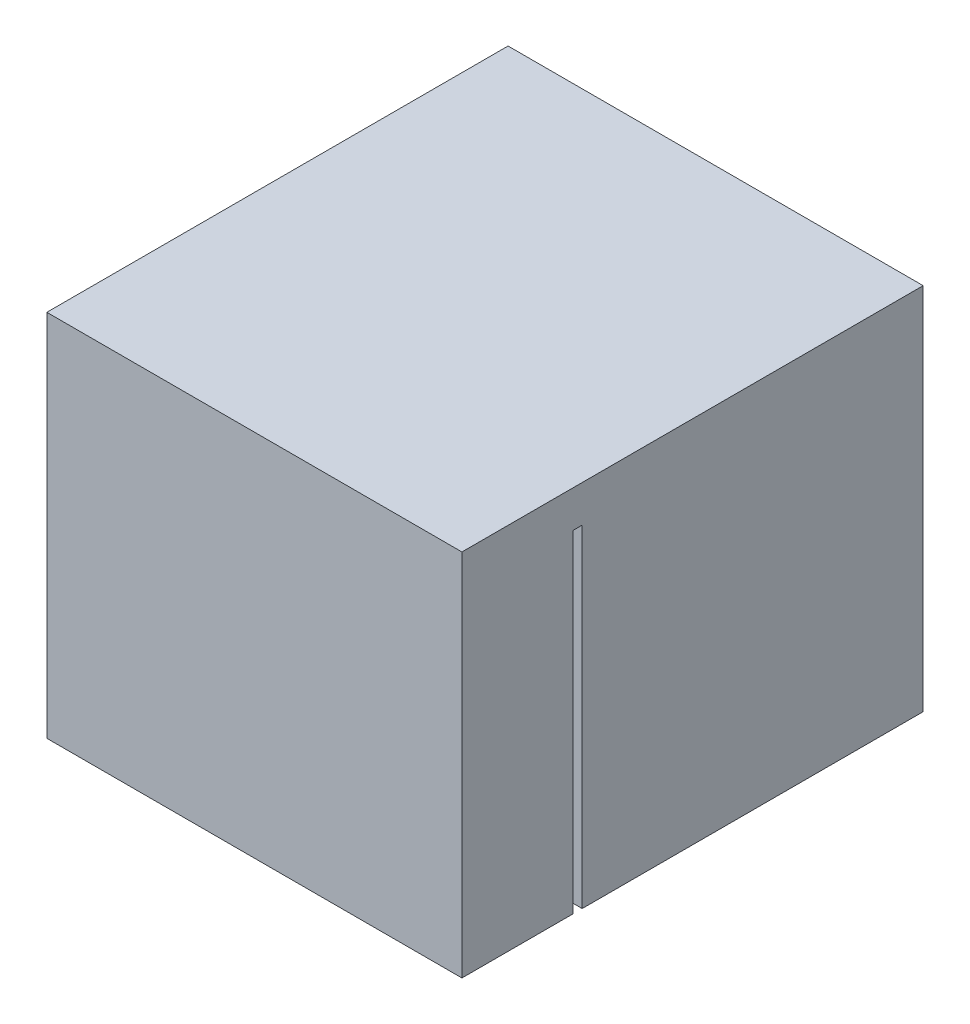
ISO-10303-21;
HEADER;
FILE_DESCRIPTION(('STEP AP214'),'2;1');
FILE_NAME('part.step','',(''),(''),'','','');
FILE_SCHEMA(('AUTOMOTIVE_DESIGN { 1 0 10303 214 1 1 1 1 }'));
ENDSEC;
DATA;
#1=APPLICATION_CONTEXT('core data for automotive mechanical design processes');
#2=APPLICATION_PROTOCOL_DEFINITION('international standard','automotive_design',2000,#1);
#3=PRODUCT_CONTEXT('',#1,'mechanical');
#4=PRODUCT('Part','Part','',(#3));
#5=PRODUCT_RELATED_PRODUCT_CATEGORY('part','',(#4));
#6=PRODUCT_DEFINITION_FORMATION('','',#4);
#7=PRODUCT_DEFINITION_CONTEXT('part definition',#1,'design');
#8=PRODUCT_DEFINITION('design','',#6,#7);
#9=PRODUCT_DEFINITION_SHAPE('','',#8);
#10=(LENGTH_UNIT() NAMED_UNIT(*) SI_UNIT(.MILLI.,.METRE.));
#11=(NAMED_UNIT(*) PLANE_ANGLE_UNIT() SI_UNIT($,.RADIAN.));
#12=(NAMED_UNIT(*) SI_UNIT($,.STERADIAN.) SOLID_ANGLE_UNIT());
#13=UNCERTAINTY_MEASURE_WITH_UNIT(LENGTH_MEASURE(1.E-05),#10,'distance_accuracy_value','');
#14=(GEOMETRIC_REPRESENTATION_CONTEXT(3) GLOBAL_UNCERTAINTY_ASSIGNED_CONTEXT((#13)) GLOBAL_UNIT_ASSIGNED_CONTEXT((#10,
#11,#12)) REPRESENTATION_CONTEXT('',''));
#15=CARTESIAN_POINT('',(0.,0.,0.));
#16=DIRECTION('',(0.,0.,1.));
#17=DIRECTION('',(1.,0.,0.));
#18=AXIS2_PLACEMENT_3D('',#15,#16,#17);
#19=CARTESIAN_POINT('',(275.,29.8959813156576,57.8606367334853));
#20=DIRECTION('',(0.,1.,0.));
#21=DIRECTION('',(-1.,0.,0.));
#22=AXIS2_PLACEMENT_3D('',#19,#20,#21);
#23=PLANE('',#22);
#24=CARTESIAN_POINT('',(236.1003731068,29.8959813156576,50.8138150272263));
#25=DIRECTION('',(0.,-1.,0.));
#26=DIRECTION('',(-1.,0.,0.));
#27=AXIS2_PLACEMENT_3D('',#24,#25,#26);
#28=CIRCLE('',#27,4.);
#29=CARTESIAN_POINT('',(232.1003731068,29.8959813156576,50.8138150272263));
#30=VERTEX_POINT('',#29);
#31=CARTESIAN_POINT('',(236.1003731068,29.8959813156576,46.8138150272262));
#32=VERTEX_POINT('',#31);
#33=EDGE_CURVE('E392',#30,#32,#28,.T.);
#34=ORIENTED_EDGE('',*,*,#33,.F.);
#35=DIRECTION('',(0.,0.,-1.));
#36=VECTOR('',#35,1.);
#37=CARTESIAN_POINT('',(232.1003731068,29.8959813156576,56.186716494128));
#38=LINE('',#37,#36);
#39=CARTESIAN_POINT('',(232.1003731068,29.8959813156576,56.186716494128));
#40=VERTEX_POINT('',#39);
#41=EDGE_CURVE('E360',#40,#30,#38,.T.);
#42=ORIENTED_EDGE('',*,*,#41,.F.);
#43=DIRECTION('',(-1.,0.,0.));
#44=VECTOR('',#43,1.);
#45=CARTESIAN_POINT('',(232.1003731068,29.8959813156576,56.186716494128));
#46=LINE('',#45,#44);
#47=CARTESIAN_POINT('',(248.270168113502,29.8959813156576,56.186716494128));
#48=VERTEX_POINT('',#47);
#49=EDGE_CURVE('E375',#48,#40,#46,.T.);
#50=ORIENTED_EDGE('',*,*,#49,.F.);
#51=DIRECTION('',(0.,0.,1.));
#52=VECTOR('',#51,1.);
#53=CARTESIAN_POINT('',(248.270168113502,29.8959813156576,56.186716494128));
#54=LINE('',#53,#52);
#55=CARTESIAN_POINT('',(248.270168113502,29.8959813156576,50.8138150272263));
#56=VERTEX_POINT('',#55);
#57=EDGE_CURVE('E401',#56,#48,#54,.T.);
#58=ORIENTED_EDGE('',*,*,#57,.F.);
#59=CARTESIAN_POINT('',(244.270168113502,29.8959813156576,50.8138150272263));
#60=DIRECTION('',(0.,-1.,0.));
#61=DIRECTION('',(1.,0.,0.));
#62=AXIS2_PLACEMENT_3D('',#59,#60,#61);
#63=CIRCLE('',#62,4.);
#64=CARTESIAN_POINT('',(244.270168113502,29.8959813156576,46.8138150272262));
#65=VERTEX_POINT('',#64);
#66=EDGE_CURVE('E398',#65,#56,#63,.T.);
#67=ORIENTED_EDGE('',*,*,#66,.F.);
#68=DIRECTION('',(1.,0.,0.));
#69=VECTOR('',#68,1.);
#70=CARTESIAN_POINT('',(236.1003731068,29.8959813156576,46.8138150272262));
#71=LINE('',#70,#69);
#72=EDGE_CURVE('E395',#32,#65,#71,.T.);
#73=ORIENTED_EDGE('',*,*,#72,.F.);
#74=EDGE_LOOP('',(#34,#42,#50,#58,#67,#73));
#75=FACE_BOUND('',#74,.T.);
#76=DIRECTION('',(1.,0.,0.));
#77=VECTOR('',#76,1.);
#78=CARTESIAN_POINT('',(258.144488142202,29.8959813156576,48.186716494128));
#79=LINE('',#78,#77);
#80=CARTESIAN_POINT('',(258.144488142202,29.8959813156576,48.186716494128));
#81=VERTEX_POINT('',#80);
#82=CARTESIAN_POINT('',(272.144488142202,29.8959813156576,48.186716494128));
#83=VERTEX_POINT('',#82);
#84=EDGE_CURVE('E306',#81,#83,#79,.T.);
#85=ORIENTED_EDGE('',*,*,#84,.F.);
#86=DIRECTION('',(0.,0.,-1.));
#87=VECTOR('',#86,1.);
#88=CARTESIAN_POINT('',(258.144488142202,29.8959813156576,56.186716494128));
#89=LINE('',#88,#87);
#90=CARTESIAN_POINT('',(258.144488142202,29.8959813156576,56.186716494128));
#91=VERTEX_POINT('',#90);
#92=EDGE_CURVE('E68',#91,#81,#89,.T.);
#93=ORIENTED_EDGE('',*,*,#92,.F.);
#94=DIRECTION('',(-1.,0.,0.));
#95=VECTOR('',#94,1.);
#96=CARTESIAN_POINT('',(258.144488142202,29.8959813156576,56.186716494128));
#97=LINE('',#96,#95);
#98=CARTESIAN_POINT('',(272.144488142202,29.8959813156576,56.186716494128));
#99=VERTEX_POINT('',#98);
#100=EDGE_CURVE('E295',#99,#91,#97,.T.);
#101=ORIENTED_EDGE('',*,*,#100,.F.);
#102=DIRECTION('',(0.,0.,1.));
#103=VECTOR('',#102,1.);
#104=CARTESIAN_POINT('',(272.144488142202,29.8959813156576,56.186716494128));
#105=LINE('',#104,#103);
#106=EDGE_CURVE('E309',#83,#99,#105,.T.);
#107=ORIENTED_EDGE('',*,*,#106,.F.);
#108=EDGE_LOOP('',(#85,#93,#101,#107));
#109=FACE_BOUND('',#108,.T.);
#110=DIRECTION('',(0.,0.,-1.));
#111=VECTOR('',#110,1.);
#112=CARTESIAN_POINT('',(230.,29.8959813156576,57.8606367334853));
#113=LINE('',#112,#111);
#114=CARTESIAN_POINT('',(230.,29.8959813156576,57.8606367334853));
#115=VERTEX_POINT('',#114);
#116=CARTESIAN_POINT('',(230.,29.8959813156576,45.8257876116402));
#117=VERTEX_POINT('',#116);
#118=EDGE_CURVE('E441',#115,#117,#113,.T.);
#119=ORIENTED_EDGE('',*,*,#118,.T.);
#120=DIRECTION('',(-1.,0.,0.));
#121=VECTOR('',#120,1.);
#122=CARTESIAN_POINT('',(230.,29.8959813156576,45.8257876116402));
#123=LINE('',#122,#121);
#124=CARTESIAN_POINT('',(275.,29.8959813156576,45.8257876116402));
#125=VERTEX_POINT('',#124);
#126=EDGE_CURVE('E245',#125,#117,#123,.T.);
#127=ORIENTED_EDGE('',*,*,#126,.F.);
#128=DIRECTION('',(0.,0.,-1.));
#129=VECTOR('',#128,1.);
#130=CARTESIAN_POINT('',(275.,29.8959813156576,57.8606367334853));
#131=LINE('',#130,#129);
#132=CARTESIAN_POINT('',(275.,29.8959813156576,57.8606367334853));
#133=VERTEX_POINT('',#132);
#134=EDGE_CURVE('E438',#133,#125,#131,.T.);
#135=ORIENTED_EDGE('',*,*,#134,.F.);
#136=DIRECTION('',(1.,0.,0.));
#137=VECTOR('',#136,1.);
#138=CARTESIAN_POINT('',(275.,29.8959813156576,57.8606367334853));
#139=LINE('',#138,#137);
#140=EDGE_CURVE('E427',#115,#133,#139,.T.);
#141=ORIENTED_EDGE('',*,*,#140,.F.);
#142=EDGE_LOOP('',(#119,#127,#135,#141));
#143=FACE_BOUND('',#142,.T.);
#144=ADVANCED_FACE('F45',(#75,#109,#143),#23,.F.);
#145=CARTESIAN_POINT('',(275.,69.8959813156576,57.8606367334853));
#146=DIRECTION('',(-1.,0.,0.));
#147=DIRECTION('',(0.,0.,1.));
#148=AXIS2_PLACEMENT_3D('',#145,#146,#147);
#149=PLANE('',#148);
#150=ORIENTED_EDGE('',*,*,#134,.T.);
#151=DIRECTION('',(0.,-1.,0.));
#152=VECTOR('',#151,1.);
#153=CARTESIAN_POINT('',(275.,65.8959813156577,45.8257876116402));
#154=LINE('',#153,#152);
#155=CARTESIAN_POINT('',(275.,65.8959813156577,45.8257876116402));
#156=VERTEX_POINT('',#155);
#157=EDGE_CURVE('E252',#156,#125,#154,.T.);
#158=ORIENTED_EDGE('',*,*,#157,.F.);
#159=DIRECTION('',(0.,0.,1.));
#160=VECTOR('',#159,1.);
#161=CARTESIAN_POINT('',(275.,65.8959813156577,45.8257876116402));
#162=LINE('',#161,#160);
#163=CARTESIAN_POINT('',(275.,65.8959813156577,44.8257876116402));
#164=VERTEX_POINT('',#163);
#165=EDGE_CURVE('E235',#164,#156,#162,.T.);
#166=ORIENTED_EDGE('',*,*,#165,.F.);
#167=DIRECTION('',(0.,-1.,0.));
#168=VECTOR('',#167,1.);
#169=CARTESIAN_POINT('',(275.,65.8959813156577,44.8257876116402));
#170=LINE('',#169,#168);
#171=CARTESIAN_POINT('',(275.,29.8959813156576,44.8257876116402));
#172=VERTEX_POINT('',#171);
#173=EDGE_CURVE('E232',#164,#172,#170,.T.);
#174=ORIENTED_EDGE('',*,*,#173,.T.);
#175=CARTESIAN_POINT('',(275.,29.8959813156576,7.86063673348532));
#176=VERTEX_POINT('',#175);
#177=EDGE_CURVE('E429',#172,#176,#131,.T.);
#178=ORIENTED_EDGE('',*,*,#177,.T.);
#179=DIRECTION('',(0.,1.,0.));
#180=VECTOR('',#179,1.);
#181=CARTESIAN_POINT('',(275.,69.8959813156576,7.86063673348532));
#182=LINE('',#181,#180);
#183=CARTESIAN_POINT('',(275.,69.8959813156576,7.86063673348532));
#184=VERTEX_POINT('',#183);
#185=EDGE_CURVE('E408',#176,#184,#182,.T.);
#186=ORIENTED_EDGE('',*,*,#185,.T.);
#187=DIRECTION('',(0.,0.,-1.));
#188=VECTOR('',#187,1.);
#189=CARTESIAN_POINT('',(275.,69.8959813156576,57.8606367334853));
#190=LINE('',#189,#188);
#191=CARTESIAN_POINT('',(275.,69.8959813156576,57.8606367334853));
#192=VERTEX_POINT('',#191);
#193=EDGE_CURVE('E11',#192,#184,#190,.T.);
#194=ORIENTED_EDGE('',*,*,#193,.F.);
#195=DIRECTION('',(0.,1.,0.));
#196=VECTOR('',#195,1.);
#197=CARTESIAN_POINT('',(275.,69.8959813156576,57.8606367334853));
#198=LINE('',#197,#196);
#199=EDGE_CURVE('E419',#133,#192,#198,.T.);
#200=ORIENTED_EDGE('',*,*,#199,.F.);
#201=EDGE_LOOP('',(#150,#158,#166,#174,#178,#186,#194,#200));
#202=FACE_BOUND('',#201,.T.);
#203=ADVANCED_FACE('F47',(#202),#149,.F.);
#204=CARTESIAN_POINT('',(275.,69.8959813156576,57.8606367334853));
#205=DIRECTION('',(0.,-1.,0.));
#206=DIRECTION('',(0.,0.,-1.));
#207=AXIS2_PLACEMENT_3D('',#204,#205,#206);
#208=PLANE('',#207);
#209=DIRECTION('',(-1.,0.,0.));
#210=VECTOR('',#209,1.);
#211=CARTESIAN_POINT('',(275.,69.8959813156576,7.86063673348532));
#212=LINE('',#211,#210);
#213=CARTESIAN_POINT('',(230.,69.8959813156576,7.86063673348532));
#214=VERTEX_POINT('',#213);
#215=EDGE_CURVE('E432',#184,#214,#212,.T.);
#216=ORIENTED_EDGE('',*,*,#215,.T.);
#217=DIRECTION('',(0.,0.,-1.));
#218=VECTOR('',#217,1.);
#219=CARTESIAN_POINT('',(230.,69.8959813156576,57.8606367334853));
#220=LINE('',#219,#218);
#221=CARTESIAN_POINT('',(230.,69.8959813156576,57.8606367334853));
#222=VERTEX_POINT('',#221);
#223=EDGE_CURVE('E53',#222,#214,#220,.T.);
#224=ORIENTED_EDGE('',*,*,#223,.F.);
#225=DIRECTION('',(-1.,0.,0.));
#226=VECTOR('',#225,1.);
#227=CARTESIAN_POINT('',(275.,69.8959813156576,57.8606367334853));
#228=LINE('',#227,#226);
#229=EDGE_CURVE('E422',#192,#222,#228,.T.);
#230=ORIENTED_EDGE('',*,*,#229,.F.);
#231=ORIENTED_EDGE('',*,*,#193,.T.);
#232=EDGE_LOOP('',(#216,#224,#230,#231));
#233=FACE_BOUND('',#232,.T.);
#234=ADVANCED_FACE('F473',(#233),#208,.F.);
#235=CARTESIAN_POINT('',(230.,69.8959813156576,57.8606367334853));
#236=DIRECTION('',(1.,0.,0.));
#237=DIRECTION('',(0.,0.,-1.));
#238=AXIS2_PLACEMENT_3D('',#235,#236,#237);
#239=PLANE('',#238);
#240=DIRECTION('',(0.,0.,-1.));
#241=VECTOR('',#240,1.);
#242=CARTESIAN_POINT('',(230.,65.8959813156576,45.8257876116402));
#243=LINE('',#242,#241);
#244=CARTESIAN_POINT('',(230.,65.8959813156576,45.8257876116402));
#245=VERTEX_POINT('',#244);
#246=CARTESIAN_POINT('',(230.,65.8959813156576,44.8257876116402));
#247=VERTEX_POINT('',#246);
#248=EDGE_CURVE('E236',#245,#247,#243,.T.);
#249=ORIENTED_EDGE('',*,*,#248,.F.);
#250=DIRECTION('',(0.,-1.,0.));
#251=VECTOR('',#250,1.);
#252=CARTESIAN_POINT('',(230.,65.8959813156576,45.8257876116402));
#253=LINE('',#252,#251);
#254=EDGE_CURVE('E275',#245,#117,#253,.T.);
#255=ORIENTED_EDGE('',*,*,#254,.T.);
#256=ORIENTED_EDGE('',*,*,#118,.F.);
#257=DIRECTION('',(0.,-1.,0.));
#258=VECTOR('',#257,1.);
#259=CARTESIAN_POINT('',(230.,69.8959813156576,57.8606367334853));
#260=LINE('',#259,#258);
#261=EDGE_CURVE('E425',#222,#115,#260,.T.);
#262=ORIENTED_EDGE('',*,*,#261,.F.);
#263=ORIENTED_EDGE('',*,*,#223,.T.);
#264=DIRECTION('',(0.,-1.,0.));
#265=VECTOR('',#264,1.);
#266=CARTESIAN_POINT('',(230.,69.8959813156576,7.86063673348532));
#267=LINE('',#266,#265);
#268=CARTESIAN_POINT('',(230.,29.8959813156576,7.86063673348532));
#269=VERTEX_POINT('',#268);
#270=EDGE_CURVE('E434',#214,#269,#267,.T.);
#271=ORIENTED_EDGE('',*,*,#270,.T.);
#272=CARTESIAN_POINT('',(230.,29.8959813156576,44.8257876116402));
#273=VERTEX_POINT('',#272);
#274=EDGE_CURVE('E250',#273,#269,#113,.T.);
#275=ORIENTED_EDGE('',*,*,#274,.F.);
#276=DIRECTION('',(0.,-1.,0.));
#277=VECTOR('',#276,1.);
#278=CARTESIAN_POINT('',(230.,65.8959813156576,44.8257876116402));
#279=LINE('',#278,#277);
#280=EDGE_CURVE('E60',#247,#273,#279,.T.);
#281=ORIENTED_EDGE('',*,*,#280,.F.);
#282=EDGE_LOOP('',(#249,#255,#256,#262,#263,#271,#275,#281));
#283=FACE_BOUND('',#282,.T.);
#284=ADVANCED_FACE('F248',(#283),#239,.F.);
#285=ORIENTED_EDGE('',*,*,#177,.F.);
#286=DIRECTION('',(1.,0.,0.));
#287=VECTOR('',#286,1.);
#288=CARTESIAN_POINT('',(230.,29.8959813156576,44.8257876116402));
#289=LINE('',#288,#287);
#290=EDGE_CURVE('E456',#273,#172,#289,.T.);
#291=ORIENTED_EDGE('',*,*,#290,.F.);
#292=ORIENTED_EDGE('',*,*,#274,.T.);
#293=DIRECTION('',(1.,0.,0.));
#294=VECTOR('',#293,1.);
#295=CARTESIAN_POINT('',(275.,29.8959813156576,7.86063673348532));
#296=LINE('',#295,#294);
#297=EDGE_CURVE('E423',#269,#176,#296,.T.);
#298=ORIENTED_EDGE('',*,*,#297,.T.);
#299=EDGE_LOOP('',(#285,#291,#292,#298));
#300=FACE_BOUND('',#299,.T.);
#301=ADVANCED_FACE('F455',(#300),#23,.F.);
#302=CARTESIAN_POINT('',(0.,0.,57.8606367334853));
#303=DIRECTION('',(0.,0.,-1.));
#304=DIRECTION('',(-1.,0.,0.));
#305=AXIS2_PLACEMENT_3D('',#302,#303,#304);
#306=PLANE('',#305);
#307=ORIENTED_EDGE('',*,*,#199,.T.);
#308=ORIENTED_EDGE('',*,*,#229,.T.);
#309=ORIENTED_EDGE('',*,*,#261,.T.);
#310=ORIENTED_EDGE('',*,*,#140,.T.);
#311=EDGE_LOOP('',(#307,#308,#309,#310));
#312=FACE_BOUND('',#311,.T.);
#313=ADVANCED_FACE('F472',(#312),#306,.F.);
#314=CARTESIAN_POINT('',(0.,0.,7.86063673348532));
#315=DIRECTION('',(0.,0.,-1.));
#316=DIRECTION('',(-1.,0.,0.));
#317=AXIS2_PLACEMENT_3D('',#314,#315,#316);
#318=PLANE('',#317);
#319=ORIENTED_EDGE('',*,*,#185,.F.);
#320=ORIENTED_EDGE('',*,*,#297,.F.);
#321=ORIENTED_EDGE('',*,*,#270,.F.);
#322=ORIENTED_EDGE('',*,*,#215,.F.);
#323=EDGE_LOOP('',(#319,#320,#321,#322));
#324=FACE_BOUND('',#323,.T.);
#325=ADVANCED_FACE('F452',(#324),#318,.T.);
#326=CARTESIAN_POINT('',(232.1003731068,31.8959813156576,56.186716494128));
#327=DIRECTION('',(-1.,0.,0.));
#328=DIRECTION('',(0.,-1.,0.));
#329=AXIS2_PLACEMENT_3D('',#326,#327,#328);
#330=PLANE('',#329);
#331=ORIENTED_EDGE('',*,*,#41,.T.);
#332=DIRECTION('',(0.,-1.,0.));
#333=VECTOR('',#332,1.);
#334=CARTESIAN_POINT('',(232.1003731068,31.8959813156576,50.8138150272263));
#335=LINE('',#334,#333);
#336=CARTESIAN_POINT('',(232.1003731068,31.8959813156576,50.8138150272263));
#337=VERTEX_POINT('',#336);
#338=EDGE_CURVE('E390',#337,#30,#335,.T.);
#339=ORIENTED_EDGE('',*,*,#338,.F.);
#340=DIRECTION('',(0.,0.,-1.));
#341=VECTOR('',#340,1.);
#342=CARTESIAN_POINT('',(232.1003731068,31.8959813156576,56.186716494128));
#343=LINE('',#342,#341);
#344=CARTESIAN_POINT('',(232.1003731068,31.8959813156576,56.186716494128));
#345=VERTEX_POINT('',#344);
#346=EDGE_CURVE('E371',#345,#337,#343,.T.);
#347=ORIENTED_EDGE('',*,*,#346,.F.);
#348=DIRECTION('',(0.,-1.,0.));
#349=VECTOR('',#348,1.);
#350=CARTESIAN_POINT('',(232.1003731068,31.8959813156576,56.186716494128));
#351=LINE('',#350,#349);
#352=EDGE_CURVE('E406',#345,#40,#351,.T.);
#353=ORIENTED_EDGE('',*,*,#352,.T.);
#354=EDGE_LOOP('',(#331,#339,#347,#353));
#355=FACE_BOUND('',#354,.T.);
#356=ADVANCED_FACE('F541',(#355),#330,.F.);
#357=CARTESIAN_POINT('',(232.1003731068,31.8959813156576,56.186716494128));
#358=DIRECTION('',(0.,0.,1.));
#359=DIRECTION('',(1.,0.,0.));
#360=AXIS2_PLACEMENT_3D('',#357,#358,#359);
#361=PLANE('',#360);
#362=ORIENTED_EDGE('',*,*,#49,.T.);
#363=ORIENTED_EDGE('',*,*,#352,.F.);
#364=DIRECTION('',(-1.,0.,0.));
#365=VECTOR('',#364,1.);
#366=CARTESIAN_POINT('',(232.1003731068,31.8959813156576,56.186716494128));
#367=LINE('',#366,#365);
#368=CARTESIAN_POINT('',(248.270168113502,31.8959813156576,56.186716494128));
#369=VERTEX_POINT('',#368);
#370=EDGE_CURVE('E387',#369,#345,#367,.T.);
#371=ORIENTED_EDGE('',*,*,#370,.F.);
#372=DIRECTION('',(0.,-1.,0.));
#373=VECTOR('',#372,1.);
#374=CARTESIAN_POINT('',(248.270168113502,31.8959813156576,56.186716494128));
#375=LINE('',#374,#373);
#376=EDGE_CURVE('E409',#369,#48,#375,.T.);
#377=ORIENTED_EDGE('',*,*,#376,.T.);
#378=EDGE_LOOP('',(#362,#363,#371,#377));
#379=FACE_BOUND('',#378,.T.);
#380=ADVANCED_FACE('F558',(#379),#361,.F.);
#381=CARTESIAN_POINT('',(248.270168113502,31.8959813156576,56.186716494128));
#382=DIRECTION('',(1.,0.,0.));
#383=DIRECTION('',(0.,1.,0.));
#384=AXIS2_PLACEMENT_3D('',#381,#382,#383);
#385=PLANE('',#384);
#386=ORIENTED_EDGE('',*,*,#57,.T.);
#387=ORIENTED_EDGE('',*,*,#376,.F.);
#388=DIRECTION('',(0.,0.,1.));
#389=VECTOR('',#388,1.);
#390=CARTESIAN_POINT('',(248.270168113502,31.8959813156576,56.186716494128));
#391=LINE('',#390,#389);
#392=CARTESIAN_POINT('',(248.270168113502,31.8959813156576,50.8138150272263));
#393=VERTEX_POINT('',#392);
#394=EDGE_CURVE('E384',#393,#369,#391,.T.);
#395=ORIENTED_EDGE('',*,*,#394,.F.);
#396=DIRECTION('',(0.,-1.,0.));
#397=VECTOR('',#396,1.);
#398=CARTESIAN_POINT('',(248.270168113502,31.8959813156576,50.8138150272263));
#399=LINE('',#398,#397);
#400=EDGE_CURVE('E411',#393,#56,#399,.T.);
#401=ORIENTED_EDGE('',*,*,#400,.T.);
#402=EDGE_LOOP('',(#386,#387,#395,#401));
#403=FACE_BOUND('',#402,.T.);
#404=ADVANCED_FACE('F555',(#403),#385,.F.);
#405=CARTESIAN_POINT('',(244.270168113502,31.8959813156576,50.8138150272263));
#406=DIRECTION('',(0.,-1.,0.));
#407=DIRECTION('',(1.,0.,0.));
#408=AXIS2_PLACEMENT_3D('',#405,#406,#407);
#409=CYLINDRICAL_SURFACE('',#408,4.);
#410=ORIENTED_EDGE('',*,*,#66,.T.);
#411=ORIENTED_EDGE('',*,*,#400,.F.);
#412=CARTESIAN_POINT('',(244.270168113502,31.8959813156576,50.8138150272263));
#413=DIRECTION('',(0.,-1.,0.));
#414=DIRECTION('',(1.,0.,0.));
#415=AXIS2_PLACEMENT_3D('',#412,#413,#414);
#416=CIRCLE('',#415,4.);
#417=CARTESIAN_POINT('',(244.270168113502,31.8959813156576,46.8138150272262));
#418=VERTEX_POINT('',#417);
#419=EDGE_CURVE('E381',#418,#393,#416,.T.);
#420=ORIENTED_EDGE('',*,*,#419,.F.);
#421=DIRECTION('',(0.,-1.,0.));
#422=VECTOR('',#421,1.);
#423=CARTESIAN_POINT('',(244.270168113502,31.8959813156576,46.8138150272262));
#424=LINE('',#423,#422);
#425=EDGE_CURVE('E413',#418,#65,#424,.T.);
#426=ORIENTED_EDGE('',*,*,#425,.T.);
#427=EDGE_LOOP('',(#410,#411,#420,#426));
#428=FACE_BOUND('',#427,.T.);
#429=ADVANCED_FACE('F551',(#428),#409,.F.);
#430=CARTESIAN_POINT('',(236.1003731068,31.8959813156576,46.8138150272262));
#431=DIRECTION('',(0.,0.,-1.));
#432=DIRECTION('',(-1.,0.,0.));
#433=AXIS2_PLACEMENT_3D('',#430,#431,#432);
#434=PLANE('',#433);
#435=ORIENTED_EDGE('',*,*,#72,.T.);
#436=ORIENTED_EDGE('',*,*,#425,.F.);
#437=DIRECTION('',(1.,0.,0.));
#438=VECTOR('',#437,1.);
#439=CARTESIAN_POINT('',(236.1003731068,31.8959813156576,46.8138150272262));
#440=LINE('',#439,#438);
#441=CARTESIAN_POINT('',(236.1003731068,31.8959813156576,46.8138150272262));
#442=VERTEX_POINT('',#441);
#443=EDGE_CURVE('E378',#442,#418,#440,.T.);
#444=ORIENTED_EDGE('',*,*,#443,.F.);
#445=DIRECTION('',(0.,-1.,0.));
#446=VECTOR('',#445,1.);
#447=CARTESIAN_POINT('',(236.1003731068,31.8959813156576,46.8138150272262));
#448=LINE('',#447,#446);
#449=EDGE_CURVE('E415',#442,#32,#448,.T.);
#450=ORIENTED_EDGE('',*,*,#449,.T.);
#451=EDGE_LOOP('',(#435,#436,#444,#450));
#452=FACE_BOUND('',#451,.T.);
#453=ADVANCED_FACE('F547',(#452),#434,.F.);
#454=CARTESIAN_POINT('',(236.1003731068,31.8959813156576,50.8138150272263));
#455=DIRECTION('',(0.,-1.,0.));
#456=DIRECTION('',(1.,0.,0.));
#457=AXIS2_PLACEMENT_3D('',#454,#455,#456);
#458=CYLINDRICAL_SURFACE('',#457,4.);
#459=ORIENTED_EDGE('',*,*,#33,.T.);
#460=ORIENTED_EDGE('',*,*,#449,.F.);
#461=CARTESIAN_POINT('',(236.1003731068,31.8959813156576,50.8138150272263));
#462=DIRECTION('',(0.,-1.,0.));
#463=DIRECTION('',(-1.,0.,0.));
#464=AXIS2_PLACEMENT_3D('',#461,#462,#463);
#465=CIRCLE('',#464,4.);
#466=EDGE_CURVE('E374',#337,#442,#465,.T.);
#467=ORIENTED_EDGE('',*,*,#466,.F.);
#468=ORIENTED_EDGE('',*,*,#338,.T.);
#469=EDGE_LOOP('',(#459,#460,#467,#468));
#470=FACE_BOUND('',#469,.T.);
#471=ADVANCED_FACE('F535',(#470),#458,.F.);
#472=CARTESIAN_POINT('',(236.1003731068,31.8959813156576,50.8138150272263));
#473=DIRECTION('',(0.,1.,0.));
#474=DIRECTION('',(-1.,0.,0.));
#475=AXIS2_PLACEMENT_3D('',#472,#473,#474);
#476=PLANE('',#475);
#477=DIRECTION('',(0.,0.,-1.));
#478=VECTOR('',#477,1.);
#479=CARTESIAN_POINT('',(233.1003731068,31.8959813156576,55.186716494128));
#480=LINE('',#479,#478);
#481=CARTESIAN_POINT('',(233.1003731068,31.8959813156576,55.186716494128));
#482=VERTEX_POINT('',#481);
#483=CARTESIAN_POINT('',(233.1003731068,31.8959813156576,50.8138150272263));
#484=VERTEX_POINT('',#483);
#485=EDGE_CURVE('E322',#482,#484,#480,.T.);
#486=ORIENTED_EDGE('',*,*,#485,.F.);
#487=DIRECTION('',(-1.,0.,0.));
#488=VECTOR('',#487,1.);
#489=CARTESIAN_POINT('',(233.1003731068,31.8959813156576,55.186716494128));
#490=LINE('',#489,#488);
#491=CARTESIAN_POINT('',(247.270168113502,31.8959813156576,55.186716494128));
#492=VERTEX_POINT('',#491);
#493=EDGE_CURVE('E338',#492,#482,#490,.T.);
#494=ORIENTED_EDGE('',*,*,#493,.F.);
#495=DIRECTION('',(0.,0.,1.));
#496=VECTOR('',#495,1.);
#497=CARTESIAN_POINT('',(247.270168113502,31.8959813156576,55.186716494128));
#498=LINE('',#497,#496);
#499=CARTESIAN_POINT('',(247.270168113502,31.8959813156576,50.8138150272263));
#500=VERTEX_POINT('',#499);
#501=EDGE_CURVE('E335',#500,#492,#498,.T.);
#502=ORIENTED_EDGE('',*,*,#501,.F.);
#503=CARTESIAN_POINT('',(244.270168113502,31.8959813156576,50.8138150272263));
#504=DIRECTION('',(0.,-1.,0.));
#505=DIRECTION('',(1.,0.,0.));
#506=AXIS2_PLACEMENT_3D('',#503,#504,#505);
#507=CIRCLE('',#506,3.);
#508=CARTESIAN_POINT('',(244.270168113502,31.8959813156576,47.8138150272263));
#509=VERTEX_POINT('',#508);
#510=EDGE_CURVE('E332',#509,#500,#507,.T.);
#511=ORIENTED_EDGE('',*,*,#510,.F.);
#512=DIRECTION('',(1.,0.,0.));
#513=VECTOR('',#512,1.);
#514=CARTESIAN_POINT('',(236.1003731068,31.8959813156576,47.8138150272263));
#515=LINE('',#514,#513);
#516=CARTESIAN_POINT('',(236.1003731068,31.8959813156576,47.8138150272263));
#517=VERTEX_POINT('',#516);
#518=EDGE_CURVE('E329',#517,#509,#515,.T.);
#519=ORIENTED_EDGE('',*,*,#518,.F.);
#520=CARTESIAN_POINT('',(236.1003731068,31.8959813156576,50.8138150272263));
#521=DIRECTION('',(0.,-1.,0.));
#522=DIRECTION('',(-1.,0.,0.));
#523=AXIS2_PLACEMENT_3D('',#520,#521,#522);
#524=CIRCLE('',#523,3.);
#525=EDGE_CURVE('E325',#484,#517,#524,.T.);
#526=ORIENTED_EDGE('',*,*,#525,.F.);
#527=EDGE_LOOP('',(#486,#494,#502,#511,#519,#526));
#528=FACE_BOUND('',#527,.T.);
#529=ORIENTED_EDGE('',*,*,#346,.T.);
#530=ORIENTED_EDGE('',*,*,#466,.T.);
#531=ORIENTED_EDGE('',*,*,#443,.T.);
#532=ORIENTED_EDGE('',*,*,#419,.T.);
#533=ORIENTED_EDGE('',*,*,#394,.T.);
#534=ORIENTED_EDGE('',*,*,#370,.T.);
#535=EDGE_LOOP('',(#529,#530,#531,#532,#533,#534));
#536=FACE_BOUND('',#535,.T.);
#537=ADVANCED_FACE('F532',(#528,#536),#476,.F.);
#538=CARTESIAN_POINT('',(233.1003731068,31.8959813156576,55.186716494128));
#539=DIRECTION('',(-1.,0.,0.));
#540=DIRECTION('',(0.,-1.,0.));
#541=AXIS2_PLACEMENT_3D('',#538,#539,#540);
#542=PLANE('',#541);
#543=DIRECTION('',(0.,0.,-1.));
#544=VECTOR('',#543,1.);
#545=CARTESIAN_POINT('',(233.1003731068,29.8959813156576,55.186716494128));
#546=LINE('',#545,#544);
#547=CARTESIAN_POINT('',(233.1003731068,29.8959813156576,55.186716494128));
#548=VERTEX_POINT('',#547);
#549=CARTESIAN_POINT('',(233.1003731068,29.8959813156576,50.8138150272263));
#550=VERTEX_POINT('',#549);
#551=EDGE_CURVE('E316',#548,#550,#546,.T.);
#552=ORIENTED_EDGE('',*,*,#551,.F.);
#553=DIRECTION('',(0.,-1.,0.));
#554=VECTOR('',#553,1.);
#555=CARTESIAN_POINT('',(233.1003731068,31.8959813156576,55.186716494128));
#556=LINE('',#555,#554);
#557=EDGE_CURVE('E358',#482,#548,#556,.T.);
#558=ORIENTED_EDGE('',*,*,#557,.F.);
#559=ORIENTED_EDGE('',*,*,#485,.T.);
#560=DIRECTION('',(0.,-1.,0.));
#561=VECTOR('',#560,1.);
#562=CARTESIAN_POINT('',(233.1003731068,31.8959813156576,50.8138150272263));
#563=LINE('',#562,#561);
#564=EDGE_CURVE('E341',#484,#550,#563,.T.);
#565=ORIENTED_EDGE('',*,*,#564,.T.);
#566=EDGE_LOOP('',(#552,#558,#559,#565));
#567=FACE_BOUND('',#566,.T.);
#568=ADVANCED_FACE('F515',(#567),#542,.T.);
#569=CARTESIAN_POINT('',(233.1003731068,31.8959813156576,55.186716494128));
#570=DIRECTION('',(0.,0.,1.));
#571=DIRECTION('',(1.,0.,0.));
#572=AXIS2_PLACEMENT_3D('',#569,#570,#571);
#573=PLANE('',#572);
#574=DIRECTION('',(-1.,0.,0.));
#575=VECTOR('',#574,1.);
#576=CARTESIAN_POINT('',(233.1003731068,29.8959813156576,55.186716494128));
#577=LINE('',#576,#575);
#578=CARTESIAN_POINT('',(247.270168113502,29.8959813156576,55.186716494128));
#579=VERTEX_POINT('',#578);
#580=EDGE_CURVE('E326',#579,#548,#577,.T.);
#581=ORIENTED_EDGE('',*,*,#580,.F.);
#582=DIRECTION('',(0.,-1.,0.));
#583=VECTOR('',#582,1.);
#584=CARTESIAN_POINT('',(247.270168113502,31.8959813156576,55.186716494128));
#585=LINE('',#584,#583);
#586=EDGE_CURVE('E361',#492,#579,#585,.T.);
#587=ORIENTED_EDGE('',*,*,#586,.F.);
#588=ORIENTED_EDGE('',*,*,#493,.T.);
#589=ORIENTED_EDGE('',*,*,#557,.T.);
#590=EDGE_LOOP('',(#581,#587,#588,#589));
#591=FACE_BOUND('',#590,.T.);
#592=ADVANCED_FACE('F530',(#591),#573,.T.);
#593=CARTESIAN_POINT('',(247.270168113502,31.8959813156576,55.186716494128));
#594=DIRECTION('',(1.,0.,0.));
#595=DIRECTION('',(0.,1.,0.));
#596=AXIS2_PLACEMENT_3D('',#593,#594,#595);
#597=PLANE('',#596);
#598=DIRECTION('',(0.,0.,1.));
#599=VECTOR('',#598,1.);
#600=CARTESIAN_POINT('',(247.270168113502,29.8959813156576,55.186716494128));
#601=LINE('',#600,#599);
#602=CARTESIAN_POINT('',(247.270168113502,29.8959813156576,50.8138150272263));
#603=VERTEX_POINT('',#602);
#604=EDGE_CURVE('E353',#603,#579,#601,.T.);
#605=ORIENTED_EDGE('',*,*,#604,.F.);
#606=DIRECTION('',(0.,-1.,0.));
#607=VECTOR('',#606,1.);
#608=CARTESIAN_POINT('',(247.270168113502,31.8959813156576,50.8138150272263));
#609=LINE('',#608,#607);
#610=EDGE_CURVE('E363',#500,#603,#609,.T.);
#611=ORIENTED_EDGE('',*,*,#610,.F.);
#612=ORIENTED_EDGE('',*,*,#501,.T.);
#613=ORIENTED_EDGE('',*,*,#586,.T.);
#614=EDGE_LOOP('',(#605,#611,#612,#613));
#615=FACE_BOUND('',#614,.T.);
#616=ADVANCED_FACE('F527',(#615),#597,.T.);
#617=CARTESIAN_POINT('',(244.270168113502,31.8959813156576,50.8138150272263));
#618=DIRECTION('',(0.,-1.,0.));
#619=DIRECTION('',(1.,0.,0.));
#620=AXIS2_PLACEMENT_3D('',#617,#618,#619);
#621=CYLINDRICAL_SURFACE('',#620,3.);
#622=CARTESIAN_POINT('',(244.270168113502,29.8959813156576,50.8138150272263));
#623=DIRECTION('',(0.,-1.,0.));
#624=DIRECTION('',(1.,0.,0.));
#625=AXIS2_PLACEMENT_3D('',#622,#623,#624);
#626=CIRCLE('',#625,3.);
#627=CARTESIAN_POINT('',(244.270168113502,29.8959813156576,47.8138150272263));
#628=VERTEX_POINT('',#627);
#629=EDGE_CURVE('E350',#628,#603,#626,.T.);
#630=ORIENTED_EDGE('',*,*,#629,.F.);
#631=DIRECTION('',(0.,-1.,0.));
#632=VECTOR('',#631,1.);
#633=CARTESIAN_POINT('',(244.270168113502,31.8959813156576,47.8138150272263));
#634=LINE('',#633,#632);
#635=EDGE_CURVE('E365',#509,#628,#634,.T.);
#636=ORIENTED_EDGE('',*,*,#635,.F.);
#637=ORIENTED_EDGE('',*,*,#510,.T.);
#638=ORIENTED_EDGE('',*,*,#610,.T.);
#639=EDGE_LOOP('',(#630,#636,#637,#638));
#640=FACE_BOUND('',#639,.T.);
#641=ADVANCED_FACE('F523',(#640),#621,.T.);
#642=CARTESIAN_POINT('',(236.1003731068,31.8959813156576,47.8138150272263));
#643=DIRECTION('',(0.,0.,-1.));
#644=DIRECTION('',(-1.,0.,0.));
#645=AXIS2_PLACEMENT_3D('',#642,#643,#644);
#646=PLANE('',#645);
#647=DIRECTION('',(1.,0.,0.));
#648=VECTOR('',#647,1.);
#649=CARTESIAN_POINT('',(236.1003731068,29.8959813156576,47.8138150272263));
#650=LINE('',#649,#648);
#651=CARTESIAN_POINT('',(236.1003731068,29.8959813156576,47.8138150272263));
#652=VERTEX_POINT('',#651);
#653=EDGE_CURVE('E347',#652,#628,#650,.T.);
#654=ORIENTED_EDGE('',*,*,#653,.F.);
#655=DIRECTION('',(0.,-1.,0.));
#656=VECTOR('',#655,1.);
#657=CARTESIAN_POINT('',(236.1003731068,31.8959813156576,47.8138150272263));
#658=LINE('',#657,#656);
#659=EDGE_CURVE('E367',#517,#652,#658,.T.);
#660=ORIENTED_EDGE('',*,*,#659,.F.);
#661=ORIENTED_EDGE('',*,*,#518,.T.);
#662=ORIENTED_EDGE('',*,*,#635,.T.);
#663=EDGE_LOOP('',(#654,#660,#661,#662));
#664=FACE_BOUND('',#663,.T.);
#665=ADVANCED_FACE('F508',(#664),#646,.T.);
#666=CARTESIAN_POINT('',(236.1003731068,31.8959813156576,50.8138150272263));
#667=DIRECTION('',(0.,-1.,0.));
#668=DIRECTION('',(1.,0.,0.));
#669=AXIS2_PLACEMENT_3D('',#666,#667,#668);
#670=CYLINDRICAL_SURFACE('',#669,3.);
#671=CARTESIAN_POINT('',(236.1003731068,29.8959813156576,50.8138150272263));
#672=DIRECTION('',(0.,-1.,0.));
#673=DIRECTION('',(-1.,0.,0.));
#674=AXIS2_PLACEMENT_3D('',#671,#672,#673);
#675=CIRCLE('',#674,3.);
#676=EDGE_CURVE('E344',#550,#652,#675,.T.);
#677=ORIENTED_EDGE('',*,*,#676,.F.);
#678=ORIENTED_EDGE('',*,*,#564,.F.);
#679=ORIENTED_EDGE('',*,*,#525,.T.);
#680=ORIENTED_EDGE('',*,*,#659,.T.);
#681=EDGE_LOOP('',(#677,#678,#679,#680));
#682=FACE_BOUND('',#681,.T.);
#683=ADVANCED_FACE('F500',(#682),#670,.T.);
#684=ORIENTED_EDGE('',*,*,#551,.T.);
#685=ORIENTED_EDGE('',*,*,#676,.T.);
#686=ORIENTED_EDGE('',*,*,#653,.T.);
#687=ORIENTED_EDGE('',*,*,#629,.T.);
#688=ORIENTED_EDGE('',*,*,#604,.T.);
#689=ORIENTED_EDGE('',*,*,#580,.T.);
#690=EDGE_LOOP('',(#684,#685,#686,#687,#688,#689));
#691=FACE_BOUND('',#690,.T.);
#692=ADVANCED_FACE('F492',(#691),#23,.F.);
#693=CARTESIAN_POINT('',(258.144488142202,31.8959813156576,56.186716494128));
#694=DIRECTION('',(-1.,0.,0.));
#695=DIRECTION('',(0.,-1.,0.));
#696=AXIS2_PLACEMENT_3D('',#693,#694,#695);
#697=PLANE('',#696);
#698=ORIENTED_EDGE('',*,*,#92,.T.);
#699=DIRECTION('',(0.,-1.,0.));
#700=VECTOR('',#699,1.);
#701=CARTESIAN_POINT('',(258.144488142202,31.8959813156576,48.186716494128));
#702=LINE('',#701,#700);
#703=CARTESIAN_POINT('',(258.144488142202,31.8959813156576,48.186716494128));
#704=VERTEX_POINT('',#703);
#705=EDGE_CURVE('E304',#704,#81,#702,.T.);
#706=ORIENTED_EDGE('',*,*,#705,.F.);
#707=DIRECTION('',(0.,0.,-1.));
#708=VECTOR('',#707,1.);
#709=CARTESIAN_POINT('',(258.144488142202,31.8959813156576,56.186716494128));
#710=LINE('',#709,#708);
#711=CARTESIAN_POINT('',(258.144488142202,31.8959813156576,56.186716494128));
#712=VERTEX_POINT('',#711);
#713=EDGE_CURVE('E291',#712,#704,#710,.T.);
#714=ORIENTED_EDGE('',*,*,#713,.F.);
#715=DIRECTION('',(0.,-1.,0.));
#716=VECTOR('',#715,1.);
#717=CARTESIAN_POINT('',(258.144488142202,31.8959813156576,56.186716494128));
#718=LINE('',#717,#716);
#719=EDGE_CURVE('E314',#712,#91,#718,.T.);
#720=ORIENTED_EDGE('',*,*,#719,.T.);
#721=EDGE_LOOP('',(#698,#706,#714,#720));
#722=FACE_BOUND('',#721,.T.);
#723=ADVANCED_FACE('F499',(#722),#697,.F.);
#724=CARTESIAN_POINT('',(258.144488142202,31.8959813156576,56.186716494128));
#725=DIRECTION('',(0.,0.,1.));
#726=DIRECTION('',(1.,0.,0.));
#727=AXIS2_PLACEMENT_3D('',#724,#725,#726);
#728=PLANE('',#727);
#729=ORIENTED_EDGE('',*,*,#100,.T.);
#730=ORIENTED_EDGE('',*,*,#719,.F.);
#731=DIRECTION('',(-1.,0.,0.));
#732=VECTOR('',#731,1.);
#733=CARTESIAN_POINT('',(258.144488142202,31.8959813156576,56.186716494128));
#734=LINE('',#733,#732);
#735=CARTESIAN_POINT('',(272.144488142202,31.8959813156576,56.186716494128));
#736=VERTEX_POINT('',#735);
#737=EDGE_CURVE('E301',#736,#712,#734,.T.);
#738=ORIENTED_EDGE('',*,*,#737,.F.);
#739=DIRECTION('',(0.,-1.,0.));
#740=VECTOR('',#739,1.);
#741=CARTESIAN_POINT('',(272.144488142202,31.8959813156576,56.186716494128));
#742=LINE('',#741,#740);
#743=EDGE_CURVE('E317',#736,#99,#742,.T.);
#744=ORIENTED_EDGE('',*,*,#743,.T.);
#745=EDGE_LOOP('',(#729,#730,#738,#744));
#746=FACE_BOUND('',#745,.T.);
#747=ADVANCED_FACE('F506',(#746),#728,.F.);
#748=CARTESIAN_POINT('',(272.144488142202,31.8959813156576,56.186716494128));
#749=DIRECTION('',(1.,0.,0.));
#750=DIRECTION('',(0.,1.,0.));
#751=AXIS2_PLACEMENT_3D('',#748,#749,#750);
#752=PLANE('',#751);
#753=ORIENTED_EDGE('',*,*,#106,.T.);
#754=ORIENTED_EDGE('',*,*,#743,.F.);
#755=DIRECTION('',(0.,0.,1.));
#756=VECTOR('',#755,1.);
#757=CARTESIAN_POINT('',(272.144488142202,31.8959813156576,56.186716494128));
#758=LINE('',#757,#756);
#759=CARTESIAN_POINT('',(272.144488142202,31.8959813156576,48.186716494128));
#760=VERTEX_POINT('',#759);
#761=EDGE_CURVE('E298',#760,#736,#758,.T.);
#762=ORIENTED_EDGE('',*,*,#761,.F.);
#763=DIRECTION('',(0.,-1.,0.));
#764=VECTOR('',#763,1.);
#765=CARTESIAN_POINT('',(272.144488142202,31.8959813156576,48.186716494128));
#766=LINE('',#765,#764);
#767=EDGE_CURVE('E319',#760,#83,#766,.T.);
#768=ORIENTED_EDGE('',*,*,#767,.T.);
#769=EDGE_LOOP('',(#753,#754,#762,#768));
#770=FACE_BOUND('',#769,.T.);
#771=ADVANCED_FACE('F651',(#770),#752,.F.);
#772=CARTESIAN_POINT('',(258.144488142202,31.8959813156576,48.186716494128));
#773=DIRECTION('',(0.,0.,-1.));
#774=DIRECTION('',(-1.,0.,0.));
#775=AXIS2_PLACEMENT_3D('',#772,#773,#774);
#776=PLANE('',#775);
#777=ORIENTED_EDGE('',*,*,#84,.T.);
#778=ORIENTED_EDGE('',*,*,#767,.F.);
#779=DIRECTION('',(1.,0.,0.));
#780=VECTOR('',#779,1.);
#781=CARTESIAN_POINT('',(258.144488142202,31.8959813156576,48.186716494128));
#782=LINE('',#781,#780);
#783=EDGE_CURVE('E294',#704,#760,#782,.T.);
#784=ORIENTED_EDGE('',*,*,#783,.F.);
#785=ORIENTED_EDGE('',*,*,#705,.T.);
#786=EDGE_LOOP('',(#777,#778,#784,#785));
#787=FACE_BOUND('',#786,.T.);
#788=ADVANCED_FACE('F682',(#787),#776,.F.);
#789=CARTESIAN_POINT('',(0.,31.8959813156576,0.));
#790=DIRECTION('',(0.,-1.,0.));
#791=DIRECTION('',(1.,0.,0.));
#792=AXIS2_PLACEMENT_3D('',#789,#790,#791);
#793=PLANE('',#792);
#794=DIRECTION('',(0.,0.,1.));
#795=VECTOR('',#794,1.);
#796=CARTESIAN_POINT('',(271.144488142202,31.8959813156576,55.186716494128));
#797=LINE('',#796,#795);
#798=CARTESIAN_POINT('',(271.144488142202,31.8959813156576,49.186716494128));
#799=VERTEX_POINT('',#798);
#800=CARTESIAN_POINT('',(271.144488142202,31.8959813156576,55.186716494128));
#801=VERTEX_POINT('',#800);
#802=EDGE_CURVE('E267',#799,#801,#797,.T.);
#803=ORIENTED_EDGE('',*,*,#802,.F.);
#804=DIRECTION('',(1.,0.,0.));
#805=VECTOR('',#804,1.);
#806=CARTESIAN_POINT('',(259.144488142202,31.8959813156576,49.186716494128));
#807=LINE('',#806,#805);
#808=CARTESIAN_POINT('',(259.144488142202,31.8959813156576,49.186716494128));
#809=VERTEX_POINT('',#808);
#810=EDGE_CURVE('E264',#809,#799,#807,.T.);
#811=ORIENTED_EDGE('',*,*,#810,.F.);
#812=DIRECTION('',(0.,0.,-1.));
#813=VECTOR('',#812,1.);
#814=CARTESIAN_POINT('',(259.144488142202,31.8959813156576,55.186716494128));
#815=LINE('',#814,#813);
#816=CARTESIAN_POINT('',(259.144488142202,31.8959813156576,55.186716494128));
#817=VERTEX_POINT('',#816);
#818=EDGE_CURVE('E260',#817,#809,#815,.T.);
#819=ORIENTED_EDGE('',*,*,#818,.F.);
#820=DIRECTION('',(-1.,0.,0.));
#821=VECTOR('',#820,1.);
#822=CARTESIAN_POINT('',(259.144488142202,31.8959813156576,55.186716494128));
#823=LINE('',#822,#821);
#824=EDGE_CURVE('E257',#801,#817,#823,.T.);
#825=ORIENTED_EDGE('',*,*,#824,.F.);
#826=EDGE_LOOP('',(#803,#811,#819,#825));
#827=FACE_BOUND('',#826,.T.);
#828=ORIENTED_EDGE('',*,*,#713,.T.);
#829=ORIENTED_EDGE('',*,*,#783,.T.);
#830=ORIENTED_EDGE('',*,*,#761,.T.);
#831=ORIENTED_EDGE('',*,*,#737,.T.);
#832=EDGE_LOOP('',(#828,#829,#830,#831));
#833=FACE_BOUND('',#832,.T.);
#834=ADVANCED_FACE('F693',(#827,#833),#793,.T.);
#835=CARTESIAN_POINT('',(259.144488142202,31.8959813156576,55.186716494128));
#836=DIRECTION('',(0.,0.,1.));
#837=DIRECTION('',(1.,0.,0.));
#838=AXIS2_PLACEMENT_3D('',#835,#836,#837);
#839=PLANE('',#838);
#840=DIRECTION('',(-1.,0.,0.));
#841=VECTOR('',#840,1.);
#842=CARTESIAN_POINT('',(259.144488142202,29.8959813156576,55.186716494128));
#843=LINE('',#842,#841);
#844=CARTESIAN_POINT('',(271.144488142202,29.8959813156576,55.186716494128));
#845=VERTEX_POINT('',#844);
#846=CARTESIAN_POINT('',(259.144488142202,29.8959813156576,55.186716494128));
#847=VERTEX_POINT('',#846);
#848=EDGE_CURVE('E271',#845,#847,#843,.T.);
#849=ORIENTED_EDGE('',*,*,#848,.F.);
#850=DIRECTION('',(0.,-1.,0.));
#851=VECTOR('',#850,1.);
#852=CARTESIAN_POINT('',(271.144488142202,31.8959813156576,55.186716494128));
#853=LINE('',#852,#851);
#854=EDGE_CURVE('E283',#801,#845,#853,.T.);
#855=ORIENTED_EDGE('',*,*,#854,.F.);
#856=ORIENTED_EDGE('',*,*,#824,.T.);
#857=DIRECTION('',(0.,-1.,0.));
#858=VECTOR('',#857,1.);
#859=CARTESIAN_POINT('',(259.144488142202,31.8959813156576,55.186716494128));
#860=LINE('',#859,#858);
#861=EDGE_CURVE('E270',#817,#847,#860,.T.);
#862=ORIENTED_EDGE('',*,*,#861,.T.);
#863=EDGE_LOOP('',(#849,#855,#856,#862));
#864=FACE_BOUND('',#863,.T.);
#865=ADVANCED_FACE('F636',(#864),#839,.T.);
#866=CARTESIAN_POINT('',(271.144488142202,31.8959813156576,55.186716494128));
#867=DIRECTION('',(1.,0.,0.));
#868=DIRECTION('',(0.,1.,0.));
#869=AXIS2_PLACEMENT_3D('',#866,#867,#868);
#870=PLANE('',#869);
#871=DIRECTION('',(0.,0.,1.));
#872=VECTOR('',#871,1.);
#873=CARTESIAN_POINT('',(271.144488142202,29.8959813156576,55.186716494128));
#874=LINE('',#873,#872);
#875=CARTESIAN_POINT('',(271.144488142202,29.8959813156576,49.186716494128));
#876=VERTEX_POINT('',#875);
#877=EDGE_CURVE('E261',#876,#845,#874,.T.);
#878=ORIENTED_EDGE('',*,*,#877,.F.);
#879=DIRECTION('',(0.,-1.,0.));
#880=VECTOR('',#879,1.);
#881=CARTESIAN_POINT('',(271.144488142202,31.8959813156576,49.186716494128));
#882=LINE('',#881,#880);
#883=EDGE_CURVE('E285',#799,#876,#882,.T.);
#884=ORIENTED_EDGE('',*,*,#883,.F.);
#885=ORIENTED_EDGE('',*,*,#802,.T.);
#886=ORIENTED_EDGE('',*,*,#854,.T.);
#887=EDGE_LOOP('',(#878,#884,#885,#886));
#888=FACE_BOUND('',#887,.T.);
#889=ADVANCED_FACE('F630',(#888),#870,.T.);
#890=CARTESIAN_POINT('',(259.144488142202,31.8959813156576,49.186716494128));
#891=DIRECTION('',(0.,0.,-1.));
#892=DIRECTION('',(-1.,0.,0.));
#893=AXIS2_PLACEMENT_3D('',#890,#891,#892);
#894=PLANE('',#893);
#895=DIRECTION('',(1.,0.,0.));
#896=VECTOR('',#895,1.);
#897=CARTESIAN_POINT('',(259.144488142202,29.8959813156576,49.186716494128));
#898=LINE('',#897,#896);
#899=CARTESIAN_POINT('',(259.144488142202,29.8959813156576,49.186716494128));
#900=VERTEX_POINT('',#899);
#901=EDGE_CURVE('E278',#900,#876,#898,.T.);
#902=ORIENTED_EDGE('',*,*,#901,.F.);
#903=DIRECTION('',(0.,-1.,0.));
#904=VECTOR('',#903,1.);
#905=CARTESIAN_POINT('',(259.144488142202,31.8959813156576,49.186716494128));
#906=LINE('',#905,#904);
#907=EDGE_CURVE('E287',#809,#900,#906,.T.);
#908=ORIENTED_EDGE('',*,*,#907,.F.);
#909=ORIENTED_EDGE('',*,*,#810,.T.);
#910=ORIENTED_EDGE('',*,*,#883,.T.);
#911=EDGE_LOOP('',(#902,#908,#909,#910));
#912=FACE_BOUND('',#911,.T.);
#913=ADVANCED_FACE('F635',(#912),#894,.T.);
#914=CARTESIAN_POINT('',(259.144488142202,31.8959813156576,55.186716494128));
#915=DIRECTION('',(-1.,0.,0.));
#916=DIRECTION('',(0.,-1.,0.));
#917=AXIS2_PLACEMENT_3D('',#914,#915,#916);
#918=PLANE('',#917);
#919=DIRECTION('',(0.,0.,-1.));
#920=VECTOR('',#919,1.);
#921=CARTESIAN_POINT('',(259.144488142202,29.8959813156576,55.186716494128));
#922=LINE('',#921,#920);
#923=EDGE_CURVE('E274',#847,#900,#922,.T.);
#924=ORIENTED_EDGE('',*,*,#923,.F.);
#925=ORIENTED_EDGE('',*,*,#861,.F.);
#926=ORIENTED_EDGE('',*,*,#818,.T.);
#927=ORIENTED_EDGE('',*,*,#907,.T.);
#928=EDGE_LOOP('',(#924,#925,#926,#927));
#929=FACE_BOUND('',#928,.T.);
#930=ADVANCED_FACE('F490',(#929),#918,.T.);
#931=ORIENTED_EDGE('',*,*,#848,.T.);
#932=ORIENTED_EDGE('',*,*,#923,.T.);
#933=ORIENTED_EDGE('',*,*,#901,.T.);
#934=ORIENTED_EDGE('',*,*,#877,.T.);
#935=EDGE_LOOP('',(#931,#932,#933,#934));
#936=FACE_BOUND('',#935,.T.);
#937=ADVANCED_FACE('F483',(#936),#23,.F.);
#938=CARTESIAN_POINT('',(230.,65.8959813156576,45.8257876116402));
#939=DIRECTION('',(0.,0.,1.));
#940=DIRECTION('',(1.,0.,0.));
#941=AXIS2_PLACEMENT_3D('',#938,#939,#940);
#942=PLANE('',#941);
#943=ORIENTED_EDGE('',*,*,#126,.T.);
#944=ORIENTED_EDGE('',*,*,#254,.F.);
#945=DIRECTION('',(-1.,0.,0.));
#946=VECTOR('',#945,1.);
#947=CARTESIAN_POINT('',(230.,65.8959813156576,45.8257876116402));
#948=LINE('',#947,#946);
#949=EDGE_CURVE('E242',#156,#245,#948,.T.);
#950=ORIENTED_EDGE('',*,*,#949,.F.);
#951=ORIENTED_EDGE('',*,*,#157,.T.);
#952=EDGE_LOOP('',(#943,#944,#950,#951));
#953=FACE_BOUND('',#952,.T.);
#954=ADVANCED_FACE('F464',(#953),#942,.F.);
#955=CARTESIAN_POINT('',(230.,65.8959813156576,44.8257876116402));
#956=DIRECTION('',(0.,0.,-1.));
#957=DIRECTION('',(-1.,0.,0.));
#958=AXIS2_PLACEMENT_3D('',#955,#956,#957);
#959=PLANE('',#958);
#960=ORIENTED_EDGE('',*,*,#290,.T.);
#961=ORIENTED_EDGE('',*,*,#173,.F.);
#962=DIRECTION('',(1.,0.,0.));
#963=VECTOR('',#962,1.);
#964=CARTESIAN_POINT('',(230.,65.8959813156576,44.8257876116402));
#965=LINE('',#964,#963);
#966=EDGE_CURVE('E228',#247,#164,#965,.T.);
#967=ORIENTED_EDGE('',*,*,#966,.F.);
#968=ORIENTED_EDGE('',*,*,#280,.T.);
#969=EDGE_LOOP('',(#960,#961,#967,#968));
#970=FACE_BOUND('',#969,.T.);
#971=ADVANCED_FACE('F230',(#970),#959,.F.);
#972=CARTESIAN_POINT('',(0.,65.8959813156576,0.));
#973=DIRECTION('',(0.,-1.,0.));
#974=DIRECTION('',(1.,0.,0.));
#975=AXIS2_PLACEMENT_3D('',#972,#973,#974);
#976=PLANE('',#975);
#977=ORIENTED_EDGE('',*,*,#248,.T.);
#978=ORIENTED_EDGE('',*,*,#966,.T.);
#979=ORIENTED_EDGE('',*,*,#165,.T.);
#980=ORIENTED_EDGE('',*,*,#949,.T.);
#981=EDGE_LOOP('',(#977,#978,#979,#980));
#982=FACE_BOUND('',#981,.T.);
#983=ADVANCED_FACE('F240',(#982),#976,.T.);
#984=CLOSED_SHELL('',(#144,#203,#234,#284,#301,#313,#325,#356,#380,#404,#429,#453,#471,#537,
#568,#592,#616,#641,#665,#683,#692,#723,#747,#771,#788,#834,#865,#889,#913,#930,#937,#954,#971,#983));
#985=MANIFOLD_SOLID_BREP('B2',#984);
#986=ADVANCED_BREP_SHAPE_REPRESENTATION('',(#18,#985),#14);
#987=SHAPE_DEFINITION_REPRESENTATION(#9,#986);
ENDSEC;
END-ISO-10303-21;
